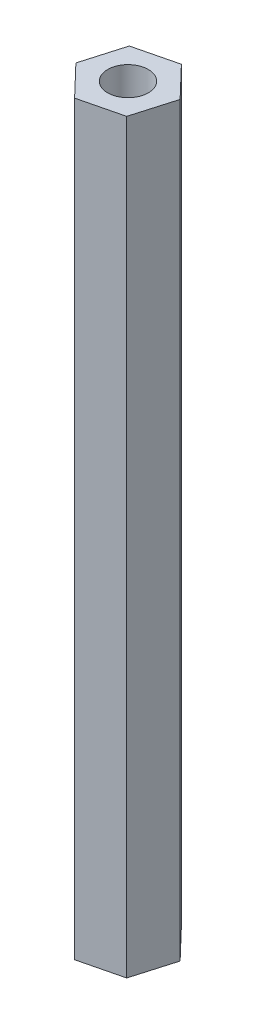
ISO-10303-21;
HEADER;
FILE_DESCRIPTION(('STEP AP214'),'2;1');
FILE_NAME('part.step','',(''),(''),'','','');
FILE_SCHEMA(('AUTOMOTIVE_DESIGN { 1 0 10303 214 1 1 1 1 }'));
ENDSEC;
DATA;
#1=APPLICATION_CONTEXT('core data for automotive mechanical design processes');
#2=APPLICATION_PROTOCOL_DEFINITION('international standard','automotive_design',2000,#1);
#3=PRODUCT_CONTEXT('',#1,'mechanical');
#4=PRODUCT('Part','Part','',(#3));
#5=PRODUCT_RELATED_PRODUCT_CATEGORY('part','',(#4));
#6=PRODUCT_DEFINITION_FORMATION('','',#4);
#7=PRODUCT_DEFINITION_CONTEXT('part definition',#1,'design');
#8=PRODUCT_DEFINITION('design','',#6,#7);
#9=PRODUCT_DEFINITION_SHAPE('','',#8);
#10=(LENGTH_UNIT() NAMED_UNIT(*) SI_UNIT(.MILLI.,.METRE.));
#11=(NAMED_UNIT(*) PLANE_ANGLE_UNIT() SI_UNIT($,.RADIAN.));
#12=(NAMED_UNIT(*) SI_UNIT($,.STERADIAN.) SOLID_ANGLE_UNIT());
#13=UNCERTAINTY_MEASURE_WITH_UNIT(LENGTH_MEASURE(1.E-05),#10,'distance_accuracy_value','');
#14=(GEOMETRIC_REPRESENTATION_CONTEXT(3) GLOBAL_UNCERTAINTY_ASSIGNED_CONTEXT((#13)) GLOBAL_UNIT_ASSIGNED_CONTEXT((#10,
#11,#12)) REPRESENTATION_CONTEXT('',''));
#15=CARTESIAN_POINT('',(0.,0.,0.));
#16=DIRECTION('',(0.,0.,1.));
#17=DIRECTION('',(1.,0.,0.));
#18=AXIS2_PLACEMENT_3D('',#15,#16,#17);
#19=CARTESIAN_POINT('',(-6.32811130994487,63.5,-2.46052037020981));
#20=DIRECTION('',(-0.238502387947703,0.,-0.971141910815944));
#21=DIRECTION('',(-0.971141910815944,0.,0.238502387947703));
#22=AXIS2_PLACEMENT_3D('',#19,#20,#21);
#23=PLANE('',#22);
#24=DIRECTION('',(0.971141910815944,0.,-0.238502387947703));
#25=VECTOR('',#24,1.);
#26=CARTESIAN_POINT('',(-6.32811130994487,0.,-2.46052037020981));
#27=LINE('',#26,#25);
#28=CARTESIAN_POINT('',(-6.32811130994487,0.,-2.46052037020981));
#29=VERTEX_POINT('',#28);
#30=CARTESIAN_POINT('',(-2.76773588288857,0.,-3.33491167377304));
#31=VERTEX_POINT('',#30);
#32=EDGE_CURVE('E120',#29,#31,#27,.T.);
#33=ORIENTED_EDGE('',*,*,#32,.T.);
#34=DIRECTION('',(0.,-1.,0.));
#35=VECTOR('',#34,1.);
#36=CARTESIAN_POINT('',(-2.76773588288857,63.5,-3.33491167377304));
#37=LINE('',#36,#35);
#38=CARTESIAN_POINT('',(-2.76773588288857,63.5,-3.33491167377304));
#39=VERTEX_POINT('',#38);
#40=EDGE_CURVE('E11',#39,#31,#37,.T.);
#41=ORIENTED_EDGE('',*,*,#40,.F.);
#42=DIRECTION('',(0.971141910815944,0.,-0.238502387947703));
#43=VECTOR('',#42,1.);
#44=CARTESIAN_POINT('',(-6.32811130994487,63.5,-2.46052037020981));
#45=LINE('',#44,#43);
#46=CARTESIAN_POINT('',(-6.32811130994487,63.5,-2.46052037020981));
#47=VERTEX_POINT('',#46);
#48=EDGE_CURVE('E131',#47,#39,#45,.T.);
#49=ORIENTED_EDGE('',*,*,#48,.F.);
#50=DIRECTION('',(0.,-1.,0.));
#51=VECTOR('',#50,1.);
#52=CARTESIAN_POINT('',(-6.32811130994487,63.5,-2.46052037020981));
#53=LINE('',#52,#51);
#54=EDGE_CURVE('E116',#47,#29,#53,.T.);
#55=ORIENTED_EDGE('',*,*,#54,.T.);
#56=EDGE_LOOP('',(#33,#41,#49,#55));
#57=FACE_BOUND('',#56,.T.);
#58=ADVANCED_FACE('F36',(#57),#23,.F.);
#59=CARTESIAN_POINT('',(-2.76773588288857,63.5,-3.33491167377304));
#60=DIRECTION('',(-0.960284759420221,0.,-0.279021828582011));
#61=DIRECTION('',(-0.279021828582011,0.,0.960284759420221));
#62=AXIS2_PLACEMENT_3D('',#59,#60,#61);
#63=PLANE('',#62);
#64=DIRECTION('',(0.279021828582011,0.,-0.960284759420221));
#65=VECTOR('',#64,1.);
#66=CARTESIAN_POINT('',(-2.76773588288857,0.,-3.33491167377304));
#67=LINE('',#66,#65);
#68=CARTESIAN_POINT('',(-1.74479325109438,0.,-6.85548289239529));
#69=VERTEX_POINT('',#68);
#70=EDGE_CURVE('E123',#31,#69,#67,.T.);
#71=ORIENTED_EDGE('',*,*,#70,.T.);
#72=DIRECTION('',(0.,-1.,0.));
#73=VECTOR('',#72,1.);
#74=CARTESIAN_POINT('',(-1.74479325109438,63.5,-6.85548289239529));
#75=LINE('',#74,#73);
#76=CARTESIAN_POINT('',(-1.74479325109438,63.5,-6.85548289239529));
#77=VERTEX_POINT('',#76);
#78=EDGE_CURVE('E44',#77,#69,#75,.T.);
#79=ORIENTED_EDGE('',*,*,#78,.F.);
#80=DIRECTION('',(0.279021828582011,0.,-0.960284759420221));
#81=VECTOR('',#80,1.);
#82=CARTESIAN_POINT('',(-2.76773588288857,63.5,-3.33491167377304));
#83=LINE('',#82,#81);
#84=EDGE_CURVE('E89',#39,#77,#83,.T.);
#85=ORIENTED_EDGE('',*,*,#84,.F.);
#86=ORIENTED_EDGE('',*,*,#40,.T.);
#87=EDGE_LOOP('',(#71,#79,#85,#86));
#88=FACE_BOUND('',#87,.T.);
#89=ADVANCED_FACE('F156',(#88),#63,.F.);
#90=CARTESIAN_POINT('',(-1.74479325109438,63.5,-6.85548289239529));
#91=DIRECTION('',(-0.721782371472518,0.,0.692120082233934));
#92=DIRECTION('',(0.692120082233934,0.,0.721782371472518));
#93=AXIS2_PLACEMENT_3D('',#90,#91,#92);
#94=PLANE('',#93);
#95=DIRECTION('',(-0.692120082233934,0.,-0.721782371472518));
#96=VECTOR('',#95,1.);
#97=CARTESIAN_POINT('',(-1.74479325109438,0.,-6.85548289239529));
#98=LINE('',#97,#96);
#99=CARTESIAN_POINT('',(-4.28222604635648,0.,-9.50166280745429));
#100=VERTEX_POINT('',#99);
#101=EDGE_CURVE('E126',#69,#100,#98,.T.);
#102=ORIENTED_EDGE('',*,*,#101,.T.);
#103=DIRECTION('',(0.,-1.,0.));
#104=VECTOR('',#103,1.);
#105=CARTESIAN_POINT('',(-4.28222604635648,63.5,-9.50166280745429));
#106=LINE('',#105,#104);
#107=CARTESIAN_POINT('',(-4.28222604635648,63.5,-9.50166280745429));
#108=VERTEX_POINT('',#107);
#109=EDGE_CURVE('E111',#108,#100,#106,.T.);
#110=ORIENTED_EDGE('',*,*,#109,.F.);
#111=DIRECTION('',(-0.692120082233934,0.,-0.721782371472518));
#112=VECTOR('',#111,1.);
#113=CARTESIAN_POINT('',(-1.74479325109438,63.5,-6.85548289239529));
#114=LINE('',#113,#112);
#115=EDGE_CURVE('E102',#77,#108,#114,.T.);
#116=ORIENTED_EDGE('',*,*,#115,.F.);
#117=ORIENTED_EDGE('',*,*,#78,.T.);
#118=EDGE_LOOP('',(#102,#110,#116,#117));
#119=FACE_BOUND('',#118,.T.);
#120=ADVANCED_FACE('F137',(#119),#94,.F.);
#121=CARTESIAN_POINT('',(-4.28222604635648,63.5,-9.50166280745429));
#122=DIRECTION('',(0.238502387947701,0.,0.971141910815944));
#123=DIRECTION('',(0.971141910815945,0.,-0.238502387947701));
#124=AXIS2_PLACEMENT_3D('',#121,#122,#123);
#125=PLANE('',#124);
#126=DIRECTION('',(-0.971141910815945,0.,0.238502387947701));
#127=VECTOR('',#126,1.);
#128=CARTESIAN_POINT('',(-4.28222604635648,0.,-9.50166280745429));
#129=LINE('',#128,#127);
#130=CARTESIAN_POINT('',(-7.84260147341278,0.,-8.62727150389105));
#131=VERTEX_POINT('',#130);
#132=EDGE_CURVE('E110',#100,#131,#129,.T.);
#133=ORIENTED_EDGE('',*,*,#132,.T.);
#134=DIRECTION('',(0.,-1.,0.));
#135=VECTOR('',#134,1.);
#136=CARTESIAN_POINT('',(-7.84260147341278,63.5,-8.62727150389105));
#137=LINE('',#136,#135);
#138=CARTESIAN_POINT('',(-7.84260147341278,63.5,-8.62727150389105));
#139=VERTEX_POINT('',#138);
#140=EDGE_CURVE('E107',#139,#131,#137,.T.);
#141=ORIENTED_EDGE('',*,*,#140,.F.);
#142=DIRECTION('',(-0.971141910815945,0.,0.238502387947701));
#143=VECTOR('',#142,1.);
#144=CARTESIAN_POINT('',(-4.28222604635648,63.5,-9.50166280745429));
#145=LINE('',#144,#143);
#146=EDGE_CURVE('E96',#108,#139,#145,.T.);
#147=ORIENTED_EDGE('',*,*,#146,.F.);
#148=ORIENTED_EDGE('',*,*,#109,.T.);
#149=EDGE_LOOP('',(#133,#141,#147,#148));
#150=FACE_BOUND('',#149,.T.);
#151=ADVANCED_FACE('F108',(#150),#125,.F.);
#152=CARTESIAN_POINT('',(-7.84260147341278,63.5,-8.62727150389105));
#153=DIRECTION('',(0.960284759420221,0.,0.27902182858201));
#154=DIRECTION('',(0.27902182858201,0.,-0.960284759420221));
#155=AXIS2_PLACEMENT_3D('',#152,#153,#154);
#156=PLANE('',#155);
#157=DIRECTION('',(-0.27902182858201,0.,0.960284759420221));
#158=VECTOR('',#157,1.);
#159=CARTESIAN_POINT('',(-7.84260147341278,0.,-8.62727150389105));
#160=LINE('',#159,#158);
#161=CARTESIAN_POINT('',(-8.86554410520697,0.,-5.10670028526881));
#162=VERTEX_POINT('',#161);
#163=EDGE_CURVE('E75',#131,#162,#160,.T.);
#164=ORIENTED_EDGE('',*,*,#163,.T.);
#165=DIRECTION('',(0.,-1.,0.));
#166=VECTOR('',#165,1.);
#167=CARTESIAN_POINT('',(-8.86554410520697,63.5,-5.10670028526881));
#168=LINE('',#167,#166);
#169=CARTESIAN_POINT('',(-8.86554410520697,63.5,-5.10670028526881));
#170=VERTEX_POINT('',#169);
#171=EDGE_CURVE('E112',#170,#162,#168,.T.);
#172=ORIENTED_EDGE('',*,*,#171,.F.);
#173=DIRECTION('',(-0.27902182858201,0.,0.960284759420221));
#174=VECTOR('',#173,1.);
#175=CARTESIAN_POINT('',(-7.84260147341278,63.5,-8.62727150389105));
#176=LINE('',#175,#174);
#177=EDGE_CURVE('E100',#139,#170,#176,.T.);
#178=ORIENTED_EDGE('',*,*,#177,.F.);
#179=ORIENTED_EDGE('',*,*,#140,.T.);
#180=EDGE_LOOP('',(#164,#172,#178,#179));
#181=FACE_BOUND('',#180,.T.);
#182=ADVANCED_FACE('F114',(#181),#156,.F.);
#183=CARTESIAN_POINT('',(-8.86554410520697,63.5,-5.10670028526881));
#184=DIRECTION('',(0.721782371472518,0.,-0.692120082233934));
#185=DIRECTION('',(-0.692120082233934,0.,-0.721782371472518));
#186=AXIS2_PLACEMENT_3D('',#183,#184,#185);
#187=PLANE('',#186);
#188=DIRECTION('',(0.692120082233934,0.,0.721782371472518));
#189=VECTOR('',#188,1.);
#190=CARTESIAN_POINT('',(-8.86554410520697,0.,-5.10670028526881));
#191=LINE('',#190,#189);
#192=EDGE_CURVE('E81',#162,#29,#191,.T.);
#193=ORIENTED_EDGE('',*,*,#192,.T.);
#194=ORIENTED_EDGE('',*,*,#54,.F.);
#195=DIRECTION('',(0.692120082233934,0.,0.721782371472518));
#196=VECTOR('',#195,1.);
#197=CARTESIAN_POINT('',(-8.86554410520697,63.5,-5.10670028526881));
#198=LINE('',#197,#196);
#199=EDGE_CURVE('E52',#170,#47,#198,.T.);
#200=ORIENTED_EDGE('',*,*,#199,.F.);
#201=ORIENTED_EDGE('',*,*,#171,.T.);
#202=EDGE_LOOP('',(#193,#194,#200,#201));
#203=FACE_BOUND('',#202,.T.);
#204=ADVANCED_FACE('F144',(#203),#187,.F.);
#205=CARTESIAN_POINT('',(0.,63.5,0.));
#206=DIRECTION('',(0.,1.,0.));
#207=DIRECTION('',(0.,0.,1.));
#208=AXIS2_PLACEMENT_3D('',#205,#206,#207);
#209=PLANE('',#208);
#210=CARTESIAN_POINT('',(-5.30516867815067,63.5,-5.98109158883205));
#211=DIRECTION('',(0.,1.,0.));
#212=DIRECTION('',(0.,0.,1.));
#213=AXIS2_PLACEMENT_3D('',#210,#211,#212);
#214=CIRCLE('',#213,1.7272);
#215=CARTESIAN_POINT('',(-5.30516867815067,63.5,-4.25389158883205));
#216=VERTEX_POINT('',#215);
#217=EDGE_CURVE('E277',#216,#216,#214,.T.);
#218=ORIENTED_EDGE('',*,*,#217,.F.);
#219=EDGE_LOOP('',(#218));
#220=FACE_BOUND('',#219,.T.);
#221=ORIENTED_EDGE('',*,*,#48,.T.);
#222=ORIENTED_EDGE('',*,*,#84,.T.);
#223=ORIENTED_EDGE('',*,*,#115,.T.);
#224=ORIENTED_EDGE('',*,*,#146,.T.);
#225=ORIENTED_EDGE('',*,*,#177,.T.);
#226=ORIENTED_EDGE('',*,*,#199,.T.);
#227=EDGE_LOOP('',(#221,#222,#223,#224,#225,#226));
#228=FACE_BOUND('',#227,.T.);
#229=ADVANCED_FACE('F98',(#220,#228),#209,.T.);
#230=CARTESIAN_POINT('',(0.,0.,0.));
#231=DIRECTION('',(0.,1.,0.));
#232=DIRECTION('',(0.,0.,1.));
#233=AXIS2_PLACEMENT_3D('',#230,#231,#232);
#234=PLANE('',#233);
#235=CARTESIAN_POINT('',(-5.30516867815067,0.,-5.98109158883205));
#236=DIRECTION('',(0.,-1.,0.));
#237=DIRECTION('',(0.,0.,-1.));
#238=AXIS2_PLACEMENT_3D('',#235,#236,#237);
#239=CIRCLE('',#238,1.7272);
#240=CARTESIAN_POINT('',(-5.30516867815067,0.,-7.70829158883205));
#241=VERTEX_POINT('',#240);
#242=EDGE_CURVE('E278',#241,#241,#239,.T.);
#243=ORIENTED_EDGE('',*,*,#242,.F.);
#244=EDGE_LOOP('',(#243));
#245=FACE_BOUND('',#244,.T.);
#246=ORIENTED_EDGE('',*,*,#32,.F.);
#247=ORIENTED_EDGE('',*,*,#192,.F.);
#248=ORIENTED_EDGE('',*,*,#163,.F.);
#249=ORIENTED_EDGE('',*,*,#132,.F.);
#250=ORIENTED_EDGE('',*,*,#101,.F.);
#251=ORIENTED_EDGE('',*,*,#70,.F.);
#252=EDGE_LOOP('',(#246,#247,#248,#249,#250,#251));
#253=FACE_BOUND('',#252,.T.);
#254=ADVANCED_FACE('F140',(#245,#253),#234,.F.);
#255=CARTESIAN_POINT('',(-5.30516867815067,53.975,-5.98109158883205));
#256=DIRECTION('',(0.,1.,0.));
#257=DIRECTION('',(0.,0.,1.));
#258=AXIS2_PLACEMENT_3D('',#255,#256,#257);
#259=CYLINDRICAL_SURFACE('',#258,1.7272);
#260=CARTESIAN_POINT('',(-5.30516867815067,53.975,-5.98109158883205));
#261=DIRECTION('',(0.,1.,0.));
#262=DIRECTION('',(0.,0.,1.));
#263=AXIS2_PLACEMENT_3D('',#260,#261,#262);
#264=CIRCLE('',#263,1.7272);
#265=CARTESIAN_POINT('',(-5.30516867815067,53.975,-4.25389158883205));
#266=VERTEX_POINT('',#265);
#267=EDGE_CURVE('E124',#266,#266,#264,.T.);
#268=CARTESIAN_POINT('',(-5.30516867815067,53.975,-4.25389158883205));
#269=CARTESIAN_POINT('',(-5.30516867815067,54.07421875,-4.25389158883205));
#270=CARTESIAN_POINT('',(-5.30516867815067,54.1734375,-4.25389158883205));
#271=CARTESIAN_POINT('',(-5.30516867815067,54.371875,-4.25389158883205));
#272=CARTESIAN_POINT('',(-5.30516867815067,54.47109375,-4.25389158883205));
#273=CARTESIAN_POINT('',(-5.30516867815067,54.66953125,-4.25389158883205));
#274=CARTESIAN_POINT('',(-5.30516867815067,54.76875,-4.25389158883205));
#275=CARTESIAN_POINT('',(-5.30516867815067,54.9671875,-4.25389158883205));
#276=CARTESIAN_POINT('',(-5.30516867815067,55.06640625,-4.25389158883205));
#277=CARTESIAN_POINT('',(-5.30516867815067,55.26484375,-4.25389158883205));
#278=CARTESIAN_POINT('',(-5.30516867815067,55.3640625,-4.25389158883205));
#279=CARTESIAN_POINT('',(-5.30516867815067,55.5625,-4.25389158883205));
#280=CARTESIAN_POINT('',(-5.30516867815067,55.66171875,-4.25389158883205));
#281=CARTESIAN_POINT('',(-5.30516867815067,55.86015625,-4.25389158883205));
#282=CARTESIAN_POINT('',(-5.30516867815067,55.959375,-4.25389158883205));
#283=CARTESIAN_POINT('',(-5.30516867815067,56.1578125,-4.25389158883205));
#284=CARTESIAN_POINT('',(-5.30516867815067,56.25703125,-4.25389158883205));
#285=CARTESIAN_POINT('',(-5.30516867815067,56.45546875,-4.25389158883205));
#286=CARTESIAN_POINT('',(-5.30516867815067,56.5546875,-4.25389158883205));
#287=CARTESIAN_POINT('',(-5.30516867815067,56.753125,-4.25389158883205));
#288=CARTESIAN_POINT('',(-5.30516867815067,56.85234375,-4.25389158883205));
#289=CARTESIAN_POINT('',(-5.30516867815067,57.05078125,-4.25389158883205));
#290=CARTESIAN_POINT('',(-5.30516867815067,57.15,-4.25389158883205));
#291=CARTESIAN_POINT('',(-5.30516867815067,57.3484375,-4.25389158883205));
#292=CARTESIAN_POINT('',(-5.30516867815067,57.44765625,-4.25389158883205));
#293=CARTESIAN_POINT('',(-5.30516867815067,57.64609375,-4.25389158883205));
#294=CARTESIAN_POINT('',(-5.30516867815067,57.7453125,-4.25389158883205));
#295=CARTESIAN_POINT('',(-5.30516867815067,57.94375,-4.25389158883205));
#296=CARTESIAN_POINT('',(-5.30516867815067,58.04296875,-4.25389158883205));
#297=CARTESIAN_POINT('',(-5.30516867815067,58.24140625,-4.25389158883205));
#298=CARTESIAN_POINT('',(-5.30516867815067,58.340625,-4.25389158883205));
#299=CARTESIAN_POINT('',(-5.30516867815067,58.5390625,-4.25389158883205));
#300=CARTESIAN_POINT('',(-5.30516867815067,58.63828125,-4.25389158883205));
#301=CARTESIAN_POINT('',(-5.30516867815067,58.83671875,-4.25389158883205));
#302=CARTESIAN_POINT('',(-5.30516867815067,58.9359375,-4.25389158883205));
#303=CARTESIAN_POINT('',(-5.30516867815067,59.134375,-4.25389158883205));
#304=CARTESIAN_POINT('',(-5.30516867815067,59.23359375,-4.25389158883205));
#305=CARTESIAN_POINT('',(-5.30516867815067,59.43203125,-4.25389158883205));
#306=CARTESIAN_POINT('',(-5.30516867815067,59.53125,-4.25389158883205));
#307=CARTESIAN_POINT('',(-5.30516867815067,59.7296875,-4.25389158883205));
#308=CARTESIAN_POINT('',(-5.30516867815067,59.82890625,-4.25389158883205));
#309=CARTESIAN_POINT('',(-5.30516867815067,60.02734375,-4.25389158883205));
#310=CARTESIAN_POINT('',(-5.30516867815067,60.1265625,-4.25389158883205));
#311=CARTESIAN_POINT('',(-5.30516867815067,60.325,-4.25389158883205));
#312=CARTESIAN_POINT('',(-5.30516867815067,60.42421875,-4.25389158883205));
#313=CARTESIAN_POINT('',(-5.30516867815067,60.62265625,-4.25389158883205));
#314=CARTESIAN_POINT('',(-5.30516867815067,60.721875,-4.25389158883205));
#315=CARTESIAN_POINT('',(-5.30516867815067,60.9203125,-4.25389158883205));
#316=CARTESIAN_POINT('',(-5.30516867815067,61.01953125,-4.25389158883205));
#317=CARTESIAN_POINT('',(-5.30516867815067,61.21796875,-4.25389158883205));
#318=CARTESIAN_POINT('',(-5.30516867815067,61.3171875,-4.25389158883205));
#319=CARTESIAN_POINT('',(-5.30516867815067,61.515625,-4.25389158883205));
#320=CARTESIAN_POINT('',(-5.30516867815067,61.61484375,-4.25389158883205));
#321=CARTESIAN_POINT('',(-5.30516867815067,61.81328125,-4.25389158883205));
#322=CARTESIAN_POINT('',(-5.30516867815067,61.9125,-4.25389158883205));
#323=CARTESIAN_POINT('',(-5.30516867815067,62.1109375,-4.25389158883205));
#324=CARTESIAN_POINT('',(-5.30516867815067,62.21015625,-4.25389158883205));
#325=CARTESIAN_POINT('',(-5.30516867815067,62.40859375,-4.25389158883205));
#326=CARTESIAN_POINT('',(-5.30516867815067,62.5078125,-4.25389158883205));
#327=CARTESIAN_POINT('',(-5.30516867815067,62.70625,-4.25389158883205));
#328=CARTESIAN_POINT('',(-5.30516867815067,62.80546875,-4.25389158883205));
#329=CARTESIAN_POINT('',(-5.30516867815067,63.00390625,-4.25389158883205));
#330=CARTESIAN_POINT('',(-5.30516867815067,63.103125,-4.25389158883205));
#331=CARTESIAN_POINT('',(-5.30516867815067,63.3015625,-4.25389158883205));
#332=CARTESIAN_POINT('',(-5.30516867815067,63.40078125,-4.25389158883205));
#333=CARTESIAN_POINT('',(-5.30516867815067,63.5,-4.25389158883205));
#334=B_SPLINE_CURVE_WITH_KNOTS('',3,(#268,#269,#270,#271,#272,#273,#274,#275,#276,#277,#278,
#279,#280,#281,#282,#283,#284,#285,#286,#287,#288,#289,#290,#291,#292,#293,#294,#295,#296,#297,
#298,#299,#300,#301,#302,#303,#304,#305,#306,#307,#308,#309,#310,#311,#312,#313,#314,#315,#316,
#317,#318,#319,#320,#321,#322,#323,#324,#325,#326,#327,#328,#329,#330,#331,#332,#333),
.UNSPECIFIED.,.F.,.F.,(4,2,2,2,2,2,2,2,2,2,2,2,2,2,2,2,2,2,2,2,2,2,2,2,2,2,2,2,2,2,2,2,4),(0.,
0.297656249999993,0.595312499999993,0.892968749999994,1.19062499999999,1.48828124999999,
1.78593749999999,2.08359374999999,2.38124999999999,2.67890624999999,2.97656249999999,
3.27421874999999,3.571875,3.86953125,4.1671875,4.46484375,4.7625,5.06015625,5.3578125,
5.65546875,5.95312499999999,6.25078124999999,6.54843749999999,6.84609374999999,7.14374999999999,
7.44140624999999,7.73906249999999,8.03671874999999,8.33437499999999,8.63203125,8.92968749999998,
9.22734374999999,9.52499999999998),.UNSPECIFIED.);
#335=EDGE_CURVE('BSEAM194',#266,#216,#334,.T.);
#336=ORIENTED_EDGE('',*,*,#267,.F.);
#337=ORIENTED_EDGE('',*,*,#217,.T.);
#338=ORIENTED_EDGE('',*,*,#335,.T.);
#339=ORIENTED_EDGE('',*,*,#335,.F.);
#340=EDGE_LOOP('',(#336,#338,#337,#339));
#341=FACE_BOUND('',#340,.T.);
#342=ADVANCED_FACE('F194',(#341),#259,.F.);
#343=CARTESIAN_POINT('',(-5.30516867815067,53.975,-5.98109158883205));
#344=DIRECTION('',(0.,1.,0.));
#345=DIRECTION('',(0.,0.,1.));
#346=AXIS2_PLACEMENT_3D('',#343,#344,#345);
#347=PLANE('',#346);
#348=ORIENTED_EDGE('',*,*,#267,.T.);
#349=EDGE_LOOP('',(#348));
#350=FACE_BOUND('',#349,.T.);
#351=ADVANCED_FACE('F204',(#350),#347,.T.);
#352=CARTESIAN_POINT('',(-5.30516867815067,9.525,-5.98109158883205));
#353=DIRECTION('',(0.,-1.,0.));
#354=DIRECTION('',(0.,0.,-1.));
#355=AXIS2_PLACEMENT_3D('',#352,#353,#354);
#356=CYLINDRICAL_SURFACE('',#355,1.7272);
#357=CARTESIAN_POINT('',(-5.30516867815067,9.525,-5.98109158883205));
#358=DIRECTION('',(0.,-1.,0.));
#359=DIRECTION('',(0.,0.,-1.));
#360=AXIS2_PLACEMENT_3D('',#357,#358,#359);
#361=CIRCLE('',#360,1.7272);
#362=CARTESIAN_POINT('',(-5.30516867815067,9.525,-7.70829158883205));
#363=VERTEX_POINT('',#362);
#364=EDGE_CURVE('E276',#363,#363,#361,.T.);
#365=CARTESIAN_POINT('',(-5.30516867815067,9.525,-7.70829158883205));
#366=CARTESIAN_POINT('',(-5.30516867815067,9.42578125,-7.70829158883205));
#367=CARTESIAN_POINT('',(-5.30516867815067,9.3265625,-7.70829158883205));
#368=CARTESIAN_POINT('',(-5.30516867815067,9.128125,-7.70829158883205));
#369=CARTESIAN_POINT('',(-5.30516867815067,9.02890625,-7.70829158883205));
#370=CARTESIAN_POINT('',(-5.30516867815067,8.83046875,-7.70829158883205));
#371=CARTESIAN_POINT('',(-5.30516867815067,8.73125,-7.70829158883205));
#372=CARTESIAN_POINT('',(-5.30516867815067,8.5328125,-7.70829158883205));
#373=CARTESIAN_POINT('',(-5.30516867815067,8.43359375,-7.70829158883205));
#374=CARTESIAN_POINT('',(-5.30516867815067,8.23515625,-7.70829158883205));
#375=CARTESIAN_POINT('',(-5.30516867815067,8.1359375,-7.70829158883205));
#376=CARTESIAN_POINT('',(-5.30516867815067,7.9375,-7.70829158883205));
#377=CARTESIAN_POINT('',(-5.30516867815067,7.83828125,-7.70829158883205));
#378=CARTESIAN_POINT('',(-5.30516867815067,7.63984375,-7.70829158883205));
#379=CARTESIAN_POINT('',(-5.30516867815067,7.540625,-7.70829158883205));
#380=CARTESIAN_POINT('',(-5.30516867815067,7.3421875,-7.70829158883205));
#381=CARTESIAN_POINT('',(-5.30516867815067,7.24296875,-7.70829158883205));
#382=CARTESIAN_POINT('',(-5.30516867815067,7.04453125,-7.70829158883205));
#383=CARTESIAN_POINT('',(-5.30516867815067,6.9453125,-7.70829158883205));
#384=CARTESIAN_POINT('',(-5.30516867815067,6.746875,-7.70829158883205));
#385=CARTESIAN_POINT('',(-5.30516867815067,6.64765625,-7.70829158883205));
#386=CARTESIAN_POINT('',(-5.30516867815067,6.44921875,-7.70829158883205));
#387=CARTESIAN_POINT('',(-5.30516867815067,6.35,-7.70829158883205));
#388=CARTESIAN_POINT('',(-5.30516867815067,6.1515625,-7.70829158883205));
#389=CARTESIAN_POINT('',(-5.30516867815067,6.05234375,-7.70829158883205));
#390=CARTESIAN_POINT('',(-5.30516867815067,5.85390625,-7.70829158883205));
#391=CARTESIAN_POINT('',(-5.30516867815067,5.7546875,-7.70829158883205));
#392=CARTESIAN_POINT('',(-5.30516867815067,5.55625,-7.70829158883205));
#393=CARTESIAN_POINT('',(-5.30516867815067,5.45703125,-7.70829158883205));
#394=CARTESIAN_POINT('',(-5.30516867815067,5.25859375,-7.70829158883205));
#395=CARTESIAN_POINT('',(-5.30516867815067,5.159375,-7.70829158883205));
#396=CARTESIAN_POINT('',(-5.30516867815067,4.9609375,-7.70829158883205));
#397=CARTESIAN_POINT('',(-5.30516867815067,4.86171875,-7.70829158883205));
#398=CARTESIAN_POINT('',(-5.30516867815067,4.66328125,-7.70829158883205));
#399=CARTESIAN_POINT('',(-5.30516867815067,4.5640625,-7.70829158883205));
#400=CARTESIAN_POINT('',(-5.30516867815067,4.365625,-7.70829158883205));
#401=CARTESIAN_POINT('',(-5.30516867815067,4.26640625,-7.70829158883205));
#402=CARTESIAN_POINT('',(-5.30516867815067,4.06796875,-7.70829158883205));
#403=CARTESIAN_POINT('',(-5.30516867815067,3.96875,-7.70829158883205));
#404=CARTESIAN_POINT('',(-5.30516867815067,3.7703125,-7.70829158883205));
#405=CARTESIAN_POINT('',(-5.30516867815067,3.67109375,-7.70829158883205));
#406=CARTESIAN_POINT('',(-5.30516867815067,3.47265625,-7.70829158883205));
#407=CARTESIAN_POINT('',(-5.30516867815067,3.3734375,-7.70829158883205));
#408=CARTESIAN_POINT('',(-5.30516867815067,3.175,-7.70829158883205));
#409=CARTESIAN_POINT('',(-5.30516867815067,3.07578125,-7.70829158883205));
#410=CARTESIAN_POINT('',(-5.30516867815067,2.87734375,-7.70829158883205));
#411=CARTESIAN_POINT('',(-5.30516867815067,2.778125,-7.70829158883205));
#412=CARTESIAN_POINT('',(-5.30516867815067,2.5796875,-7.70829158883205));
#413=CARTESIAN_POINT('',(-5.30516867815067,2.48046875,-7.70829158883205));
#414=CARTESIAN_POINT('',(-5.30516867815067,2.28203125,-7.70829158883205));
#415=CARTESIAN_POINT('',(-5.30516867815067,2.1828125,-7.70829158883205));
#416=CARTESIAN_POINT('',(-5.30516867815067,1.984375,-7.70829158883205));
#417=CARTESIAN_POINT('',(-5.30516867815067,1.88515625,-7.70829158883205));
#418=CARTESIAN_POINT('',(-5.30516867815067,1.68671875,-7.70829158883205));
#419=CARTESIAN_POINT('',(-5.30516867815067,1.5875,-7.70829158883205));
#420=CARTESIAN_POINT('',(-5.30516867815067,1.3890625,-7.70829158883205));
#421=CARTESIAN_POINT('',(-5.30516867815067,1.28984375,-7.70829158883205));
#422=CARTESIAN_POINT('',(-5.30516867815067,1.09140625,-7.70829158883205));
#423=CARTESIAN_POINT('',(-5.30516867815067,0.992187500000001,-7.70829158883205));
#424=CARTESIAN_POINT('',(-5.30516867815067,0.793750000000001,-7.70829158883205));
#425=CARTESIAN_POINT('',(-5.30516867815067,0.69453125,-7.70829158883205));
#426=CARTESIAN_POINT('',(-5.30516867815067,0.49609375,-7.70829158883205));
#427=CARTESIAN_POINT('',(-5.30516867815067,0.396875,-7.70829158883205));
#428=CARTESIAN_POINT('',(-5.30516867815067,0.1984375,-7.70829158883205));
#429=CARTESIAN_POINT('',(-5.30516867815067,0.0992187500000001,-7.70829158883205));
#430=CARTESIAN_POINT('',(-5.30516867815067,0.,-7.70829158883205));
#431=B_SPLINE_CURVE_WITH_KNOTS('',3,(#365,#366,#367,#368,#369,#370,#371,#372,#373,#374,#375,
#376,#377,#378,#379,#380,#381,#382,#383,#384,#385,#386,#387,#388,#389,#390,#391,#392,#393,#394,
#395,#396,#397,#398,#399,#400,#401,#402,#403,#404,#405,#406,#407,#408,#409,#410,#411,#412,#413,
#414,#415,#416,#417,#418,#419,#420,#421,#422,#423,#424,#425,#426,#427,#428,#429,#430),
.UNSPECIFIED.,.F.,.F.,(4,2,2,2,2,2,2,2,2,2,2,2,2,2,2,2,2,2,2,2,2,2,2,2,2,2,2,2,2,2,2,2,4),(0.,
0.29765625,0.5953125,0.892968750000001,1.190625,1.48828125,1.7859375,2.08359375,2.38125,
2.67890625,2.9765625,3.27421875,3.571875,3.86953125,4.1671875,4.46484375,4.7625,5.06015625,
5.3578125,5.65546875,5.953125,6.25078125,6.5484375,6.84609375,7.14375,7.44140625,7.7390625,
8.03671875,8.334375,8.63203125,8.9296875,9.22734375,9.525),.UNSPECIFIED.);
#432=EDGE_CURVE('BSEAM213',#363,#241,#431,.T.);
#433=ORIENTED_EDGE('',*,*,#364,.F.);
#434=ORIENTED_EDGE('',*,*,#242,.T.);
#435=ORIENTED_EDGE('',*,*,#432,.T.);
#436=ORIENTED_EDGE('',*,*,#432,.F.);
#437=EDGE_LOOP('',(#433,#435,#434,#436));
#438=FACE_BOUND('',#437,.T.);
#439=ADVANCED_FACE('F213',(#438),#356,.F.);
#440=CARTESIAN_POINT('',(-5.30516867815067,9.525,-5.98109158883205));
#441=DIRECTION('',(0.,-1.,0.));
#442=DIRECTION('',(0.,0.,-1.));
#443=AXIS2_PLACEMENT_3D('',#440,#441,#442);
#444=PLANE('',#443);
#445=ORIENTED_EDGE('',*,*,#364,.T.);
#446=EDGE_LOOP('',(#445));
#447=FACE_BOUND('',#446,.T.);
#448=ADVANCED_FACE('F222',(#447),#444,.T.);
#449=CLOSED_SHELL('',(#58,#89,#120,#151,#182,#204,#229,#254,#342,#351,#439,#448));
#450=MANIFOLD_SOLID_BREP('B2',#449);
#451=ADVANCED_BREP_SHAPE_REPRESENTATION('',(#18,#450),#14);
#452=SHAPE_DEFINITION_REPRESENTATION(#9,#451);
ENDSEC;
END-ISO-10303-21;
